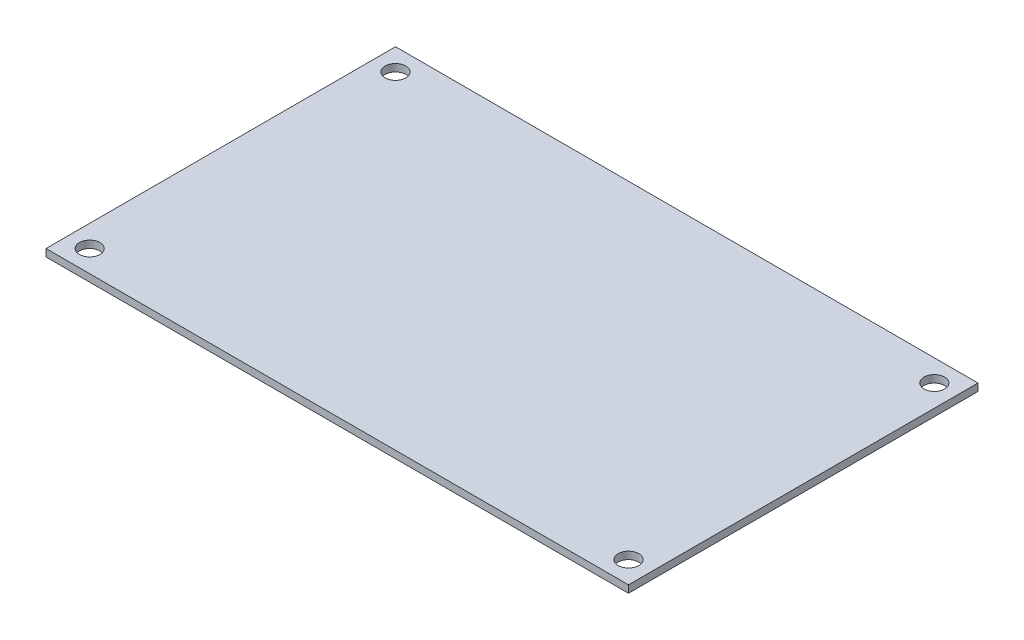
ISO-10303-21;
HEADER;
FILE_DESCRIPTION(('STEP AP214'),'2;1');
FILE_NAME('part.step','',(''),(''),'','','');
FILE_SCHEMA(('AUTOMOTIVE_DESIGN { 1 0 10303 214 1 1 1 1 }'));
ENDSEC;
DATA;
#1=APPLICATION_CONTEXT('core data for automotive mechanical design processes');
#2=APPLICATION_PROTOCOL_DEFINITION('international standard','automotive_design',2000,#1);
#3=PRODUCT_CONTEXT('',#1,'mechanical');
#4=PRODUCT('Part','Part','',(#3));
#5=PRODUCT_RELATED_PRODUCT_CATEGORY('part','',(#4));
#6=PRODUCT_DEFINITION_FORMATION('','',#4);
#7=PRODUCT_DEFINITION_CONTEXT('part definition',#1,'design');
#8=PRODUCT_DEFINITION('design','',#6,#7);
#9=PRODUCT_DEFINITION_SHAPE('','',#8);
#10=(LENGTH_UNIT() NAMED_UNIT(*) SI_UNIT(.MILLI.,.METRE.));
#11=(NAMED_UNIT(*) PLANE_ANGLE_UNIT() SI_UNIT($,.RADIAN.));
#12=(NAMED_UNIT(*) SI_UNIT($,.STERADIAN.) SOLID_ANGLE_UNIT());
#13=UNCERTAINTY_MEASURE_WITH_UNIT(LENGTH_MEASURE(1.E-05),#10,'distance_accuracy_value','');
#14=(GEOMETRIC_REPRESENTATION_CONTEXT(3) GLOBAL_UNCERTAINTY_ASSIGNED_CONTEXT((#13)) GLOBAL_UNIT_ASSIGNED_CONTEXT((#10,
#11,#12)) REPRESENTATION_CONTEXT('',''));
#15=CARTESIAN_POINT('',(0.,0.,0.));
#16=DIRECTION('',(0.,0.,1.));
#17=DIRECTION('',(1.,0.,0.));
#18=AXIS2_PLACEMENT_3D('',#15,#16,#17);
#19=CARTESIAN_POINT('',(63.5,1.6,38.1));
#20=DIRECTION('',(-1.,0.,0.));
#21=DIRECTION('',(0.,0.,1.));
#22=AXIS2_PLACEMENT_3D('',#19,#20,#21);
#23=PLANE('',#22);
#24=DIRECTION('',(0.,0.,-1.));
#25=VECTOR('',#24,1.);
#26=CARTESIAN_POINT('',(63.5,0.,38.1));
#27=LINE('',#26,#25);
#28=CARTESIAN_POINT('',(63.5,0.,38.1));
#29=VERTEX_POINT('',#28);
#30=CARTESIAN_POINT('',(63.5,0.,-38.1));
#31=VERTEX_POINT('',#30);
#32=EDGE_CURVE('E97',#29,#31,#27,.T.);
#33=ORIENTED_EDGE('',*,*,#32,.T.);
#34=DIRECTION('',(0.,-1.,0.));
#35=VECTOR('',#34,1.);
#36=CARTESIAN_POINT('',(63.5,1.6,-38.1));
#37=LINE('',#36,#35);
#38=CARTESIAN_POINT('',(63.5,1.6,-38.1));
#39=VERTEX_POINT('',#38);
#40=EDGE_CURVE('E11',#39,#31,#37,.T.);
#41=ORIENTED_EDGE('',*,*,#40,.F.);
#42=DIRECTION('',(0.,0.,-1.));
#43=VECTOR('',#42,1.);
#44=CARTESIAN_POINT('',(63.5,1.6,38.1));
#45=LINE('',#44,#43);
#46=CARTESIAN_POINT('',(63.5,1.6,38.1));
#47=VERTEX_POINT('',#46);
#48=EDGE_CURVE('E85',#47,#39,#45,.T.);
#49=ORIENTED_EDGE('',*,*,#48,.F.);
#50=DIRECTION('',(0.,-1.,0.));
#51=VECTOR('',#50,1.);
#52=CARTESIAN_POINT('',(63.5,1.6,38.1));
#53=LINE('',#52,#51);
#54=EDGE_CURVE('E93',#47,#29,#53,.T.);
#55=ORIENTED_EDGE('',*,*,#54,.T.);
#56=EDGE_LOOP('',(#33,#41,#49,#55));
#57=FACE_BOUND('',#56,.T.);
#58=ADVANCED_FACE('F34',(#57),#23,.F.);
#59=CARTESIAN_POINT('',(-63.5,1.6,-38.1));
#60=DIRECTION('',(0.,0.,1.));
#61=DIRECTION('',(1.,0.,0.));
#62=AXIS2_PLACEMENT_3D('',#59,#60,#61);
#63=PLANE('',#62);
#64=DIRECTION('',(-1.,0.,0.));
#65=VECTOR('',#64,1.);
#66=CARTESIAN_POINT('',(-63.5,0.,-38.1));
#67=LINE('',#66,#65);
#68=CARTESIAN_POINT('',(-63.5,0.,-38.1));
#69=VERTEX_POINT('',#68);
#70=EDGE_CURVE('E89',#31,#69,#67,.T.);
#71=ORIENTED_EDGE('',*,*,#70,.T.);
#72=DIRECTION('',(0.,-1.,0.));
#73=VECTOR('',#72,1.);
#74=CARTESIAN_POINT('',(-63.5,1.6,-38.1));
#75=LINE('',#74,#73);
#76=CARTESIAN_POINT('',(-63.5,1.6,-38.1));
#77=VERTEX_POINT('',#76);
#78=EDGE_CURVE('E42',#77,#69,#75,.T.);
#79=ORIENTED_EDGE('',*,*,#78,.F.);
#80=DIRECTION('',(-1.,0.,0.));
#81=VECTOR('',#80,1.);
#82=CARTESIAN_POINT('',(-63.5,1.6,-38.1));
#83=LINE('',#82,#81);
#84=EDGE_CURVE('E80',#39,#77,#83,.T.);
#85=ORIENTED_EDGE('',*,*,#84,.F.);
#86=ORIENTED_EDGE('',*,*,#40,.T.);
#87=EDGE_LOOP('',(#71,#79,#85,#86));
#88=FACE_BOUND('',#87,.T.);
#89=ADVANCED_FACE('F88',(#88),#63,.F.);
#90=CARTESIAN_POINT('',(-63.5,1.6,38.1));
#91=DIRECTION('',(1.,0.,0.));
#92=DIRECTION('',(0.,0.,-1.));
#93=AXIS2_PLACEMENT_3D('',#90,#91,#92);
#94=PLANE('',#93);
#95=DIRECTION('',(0.,0.,1.));
#96=VECTOR('',#95,1.);
#97=CARTESIAN_POINT('',(-63.5,0.,38.1));
#98=LINE('',#97,#96);
#99=CARTESIAN_POINT('',(-63.5,0.,38.1));
#100=VERTEX_POINT('',#99);
#101=EDGE_CURVE('E67',#69,#100,#98,.T.);
#102=ORIENTED_EDGE('',*,*,#101,.T.);
#103=DIRECTION('',(0.,-1.,0.));
#104=VECTOR('',#103,1.);
#105=CARTESIAN_POINT('',(-63.5,1.6,38.1));
#106=LINE('',#105,#104);
#107=CARTESIAN_POINT('',(-63.5,1.6,38.1));
#108=VERTEX_POINT('',#107);
#109=EDGE_CURVE('E90',#108,#100,#106,.T.);
#110=ORIENTED_EDGE('',*,*,#109,.F.);
#111=DIRECTION('',(0.,0.,1.));
#112=VECTOR('',#111,1.);
#113=CARTESIAN_POINT('',(-63.5,1.6,38.1));
#114=LINE('',#113,#112);
#115=EDGE_CURVE('E83',#77,#108,#114,.T.);
#116=ORIENTED_EDGE('',*,*,#115,.F.);
#117=ORIENTED_EDGE('',*,*,#78,.T.);
#118=EDGE_LOOP('',(#102,#110,#116,#117));
#119=FACE_BOUND('',#118,.T.);
#120=ADVANCED_FACE('F91',(#119),#94,.F.);
#121=CARTESIAN_POINT('',(-63.5,1.6,38.1));
#122=DIRECTION('',(0.,0.,-1.));
#123=DIRECTION('',(-1.,0.,0.));
#124=AXIS2_PLACEMENT_3D('',#121,#122,#123);
#125=PLANE('',#124);
#126=DIRECTION('',(1.,0.,0.));
#127=VECTOR('',#126,1.);
#128=CARTESIAN_POINT('',(-63.5,0.,38.1));
#129=LINE('',#128,#127);
#130=EDGE_CURVE('E73',#100,#29,#129,.T.);
#131=ORIENTED_EDGE('',*,*,#130,.T.);
#132=ORIENTED_EDGE('',*,*,#54,.F.);
#133=DIRECTION('',(1.,0.,0.));
#134=VECTOR('',#133,1.);
#135=CARTESIAN_POINT('',(-63.5,1.6,38.1));
#136=LINE('',#135,#134);
#137=EDGE_CURVE('E50',#108,#47,#136,.T.);
#138=ORIENTED_EDGE('',*,*,#137,.F.);
#139=ORIENTED_EDGE('',*,*,#109,.T.);
#140=EDGE_LOOP('',(#131,#132,#138,#139));
#141=FACE_BOUND('',#140,.T.);
#142=ADVANCED_FACE('F105',(#141),#125,.F.);
#143=CARTESIAN_POINT('',(0.,1.6,0.));
#144=DIRECTION('',(0.,-1.,0.));
#145=DIRECTION('',(0.,0.,-1.));
#146=AXIS2_PLACEMENT_3D('',#143,#144,#145);
#147=PLANE('',#146);
#148=CARTESIAN_POINT('',(-58.7375,1.6,-33.3375));
#149=DIRECTION('',(0.,1.,0.));
#150=DIRECTION('',(0.,0.,1.));
#151=AXIS2_PLACEMENT_3D('',#148,#149,#150);
#152=CIRCLE('',#151,2.24999999999999);
#153=CARTESIAN_POINT('',(-58.7375,1.6,-31.0875));
#154=VERTEX_POINT('',#153);
#155=EDGE_CURVE('E131',#154,#154,#152,.T.);
#156=ORIENTED_EDGE('',*,*,#155,.F.);
#157=EDGE_LOOP('',(#156));
#158=FACE_BOUND('',#157,.T.);
#159=CARTESIAN_POINT('',(-58.7375,1.6,33.3375));
#160=DIRECTION('',(0.,1.,0.));
#161=DIRECTION('',(0.,0.,1.));
#162=AXIS2_PLACEMENT_3D('',#159,#160,#161);
#163=CIRCLE('',#162,2.24999999999999);
#164=CARTESIAN_POINT('',(-58.7375,1.6,35.5875));
#165=VERTEX_POINT('',#164);
#166=EDGE_CURVE('E125',#165,#165,#163,.T.);
#167=ORIENTED_EDGE('',*,*,#166,.F.);
#168=EDGE_LOOP('',(#167));
#169=FACE_BOUND('',#168,.T.);
#170=CARTESIAN_POINT('',(58.7375,1.6,33.3375));
#171=DIRECTION('',(0.,1.,0.));
#172=DIRECTION('',(0.,0.,1.));
#173=AXIS2_PLACEMENT_3D('',#170,#171,#172);
#174=CIRCLE('',#173,2.24999999999999);
#175=CARTESIAN_POINT('',(58.7375,1.6,35.5875));
#176=VERTEX_POINT('',#175);
#177=EDGE_CURVE('E119',#176,#176,#174,.T.);
#178=ORIENTED_EDGE('',*,*,#177,.F.);
#179=EDGE_LOOP('',(#178));
#180=FACE_BOUND('',#179,.T.);
#181=CARTESIAN_POINT('',(58.7375,1.6,-33.3375));
#182=DIRECTION('',(0.,1.,0.));
#183=DIRECTION('',(0.,0.,1.));
#184=AXIS2_PLACEMENT_3D('',#181,#182,#183);
#185=CIRCLE('',#184,2.24999999999999);
#186=CARTESIAN_POINT('',(58.7375,1.6,-31.0875));
#187=VERTEX_POINT('',#186);
#188=EDGE_CURVE('E113',#187,#187,#185,.T.);
#189=ORIENTED_EDGE('',*,*,#188,.F.);
#190=EDGE_LOOP('',(#189));
#191=FACE_BOUND('',#190,.T.);
#192=ORIENTED_EDGE('',*,*,#48,.T.);
#193=ORIENTED_EDGE('',*,*,#84,.T.);
#194=ORIENTED_EDGE('',*,*,#115,.T.);
#195=ORIENTED_EDGE('',*,*,#137,.T.);
#196=EDGE_LOOP('',(#192,#193,#194,#195));
#197=FACE_BOUND('',#196,.T.);
#198=ADVANCED_FACE('F81',(#158,#169,#180,#191,#197),#147,.F.);
#199=CARTESIAN_POINT('',(0.,0.,0.));
#200=DIRECTION('',(0.,-1.,0.));
#201=DIRECTION('',(0.,0.,-1.));
#202=AXIS2_PLACEMENT_3D('',#199,#200,#201);
#203=PLANE('',#202);
#204=CARTESIAN_POINT('',(-58.7375,0.,-33.3375));
#205=DIRECTION('',(0.,-1.,0.));
#206=DIRECTION('',(0.,0.,-1.));
#207=AXIS2_PLACEMENT_3D('',#204,#205,#206);
#208=CIRCLE('',#207,2.24999999999998);
#209=CARTESIAN_POINT('',(-58.7375,0.,-35.5875));
#210=VERTEX_POINT('',#209);
#211=EDGE_CURVE('E128',#210,#210,#208,.T.);
#212=ORIENTED_EDGE('',*,*,#211,.F.);
#213=EDGE_LOOP('',(#212));
#214=FACE_BOUND('',#213,.T.);
#215=CARTESIAN_POINT('',(-58.7375,0.,33.3375));
#216=DIRECTION('',(0.,-1.,0.));
#217=DIRECTION('',(0.,0.,-1.));
#218=AXIS2_PLACEMENT_3D('',#215,#216,#217);
#219=CIRCLE('',#218,2.24999999999998);
#220=CARTESIAN_POINT('',(-58.7375,0.,31.0875));
#221=VERTEX_POINT('',#220);
#222=EDGE_CURVE('E122',#221,#221,#219,.T.);
#223=ORIENTED_EDGE('',*,*,#222,.F.);
#224=EDGE_LOOP('',(#223));
#225=FACE_BOUND('',#224,.T.);
#226=CARTESIAN_POINT('',(58.7375,0.,33.3375));
#227=DIRECTION('',(0.,-1.,0.));
#228=DIRECTION('',(0.,0.,-1.));
#229=AXIS2_PLACEMENT_3D('',#226,#227,#228);
#230=CIRCLE('',#229,2.24999999999998);
#231=CARTESIAN_POINT('',(58.7375,0.,31.0875));
#232=VERTEX_POINT('',#231);
#233=EDGE_CURVE('E116',#232,#232,#230,.T.);
#234=ORIENTED_EDGE('',*,*,#233,.F.);
#235=EDGE_LOOP('',(#234));
#236=FACE_BOUND('',#235,.T.);
#237=CARTESIAN_POINT('',(58.7375,0.,-33.3375));
#238=DIRECTION('',(0.,-1.,0.));
#239=DIRECTION('',(0.,0.,-1.));
#240=AXIS2_PLACEMENT_3D('',#237,#238,#239);
#241=CIRCLE('',#240,2.24999999999998);
#242=CARTESIAN_POINT('',(58.7375,0.,-35.5875));
#243=VERTEX_POINT('',#242);
#244=EDGE_CURVE('E100',#243,#243,#241,.T.);
#245=ORIENTED_EDGE('',*,*,#244,.F.);
#246=EDGE_LOOP('',(#245));
#247=FACE_BOUND('',#246,.T.);
#248=ORIENTED_EDGE('',*,*,#32,.F.);
#249=ORIENTED_EDGE('',*,*,#130,.F.);
#250=ORIENTED_EDGE('',*,*,#101,.F.);
#251=ORIENTED_EDGE('',*,*,#70,.F.);
#252=EDGE_LOOP('',(#248,#249,#250,#251));
#253=FACE_BOUND('',#252,.T.);
#254=ADVANCED_FACE('F108',(#214,#225,#236,#247,#253),#203,.T.);
#255=CARTESIAN_POINT('',(58.7375,1.6,-33.3375));
#256=DIRECTION('',(0.,1.,0.));
#257=DIRECTION('',(0.,0.,1.));
#258=AXIS2_PLACEMENT_3D('',#255,#256,#257);
#259=CYLINDRICAL_SURFACE('',#258,2.24999999999998);
#260=ORIENTED_EDGE('',*,*,#244,.T.);
#261=EDGE_LOOP('',(#260));
#262=FACE_BOUND('',#261,.T.);
#263=ORIENTED_EDGE('',*,*,#188,.T.);
#264=EDGE_LOOP('',(#263));
#265=FACE_BOUND('',#264,.T.);
#266=ADVANCED_FACE('F146',(#262,#265),#259,.F.);
#267=CARTESIAN_POINT('',(58.7375,1.6,33.3375));
#268=DIRECTION('',(0.,1.,0.));
#269=DIRECTION('',(0.,0.,1.));
#270=AXIS2_PLACEMENT_3D('',#267,#268,#269);
#271=CYLINDRICAL_SURFACE('',#270,2.24999999999998);
#272=ORIENTED_EDGE('',*,*,#233,.T.);
#273=EDGE_LOOP('',(#272));
#274=FACE_BOUND('',#273,.T.);
#275=ORIENTED_EDGE('',*,*,#177,.T.);
#276=EDGE_LOOP('',(#275));
#277=FACE_BOUND('',#276,.T.);
#278=ADVANCED_FACE('F148',(#274,#277),#271,.F.);
#279=CARTESIAN_POINT('',(-58.7375,1.6,33.3375));
#280=DIRECTION('',(0.,1.,0.));
#281=DIRECTION('',(0.,0.,1.));
#282=AXIS2_PLACEMENT_3D('',#279,#280,#281);
#283=CYLINDRICAL_SURFACE('',#282,2.24999999999998);
#284=ORIENTED_EDGE('',*,*,#222,.T.);
#285=EDGE_LOOP('',(#284));
#286=FACE_BOUND('',#285,.T.);
#287=ORIENTED_EDGE('',*,*,#166,.T.);
#288=EDGE_LOOP('',(#287));
#289=FACE_BOUND('',#288,.T.);
#290=ADVANCED_FACE('F155',(#286,#289),#283,.F.);
#291=CARTESIAN_POINT('',(-58.7375,1.6,-33.3375));
#292=DIRECTION('',(0.,1.,0.));
#293=DIRECTION('',(0.,0.,1.));
#294=AXIS2_PLACEMENT_3D('',#291,#292,#293);
#295=CYLINDRICAL_SURFACE('',#294,2.24999999999998);
#296=ORIENTED_EDGE('',*,*,#211,.T.);
#297=EDGE_LOOP('',(#296));
#298=FACE_BOUND('',#297,.T.);
#299=ORIENTED_EDGE('',*,*,#155,.T.);
#300=EDGE_LOOP('',(#299));
#301=FACE_BOUND('',#300,.T.);
#302=ADVANCED_FACE('F135',(#298,#301),#295,.F.);
#303=CLOSED_SHELL('',(#58,#89,#120,#142,#198,#254,#266,#278,#290,#302));
#304=MANIFOLD_SOLID_BREP('B2',#303);
#305=ADVANCED_BREP_SHAPE_REPRESENTATION('',(#18,#304),#14);
#306=SHAPE_DEFINITION_REPRESENTATION(#9,#305);
ENDSEC;
END-ISO-10303-21;
